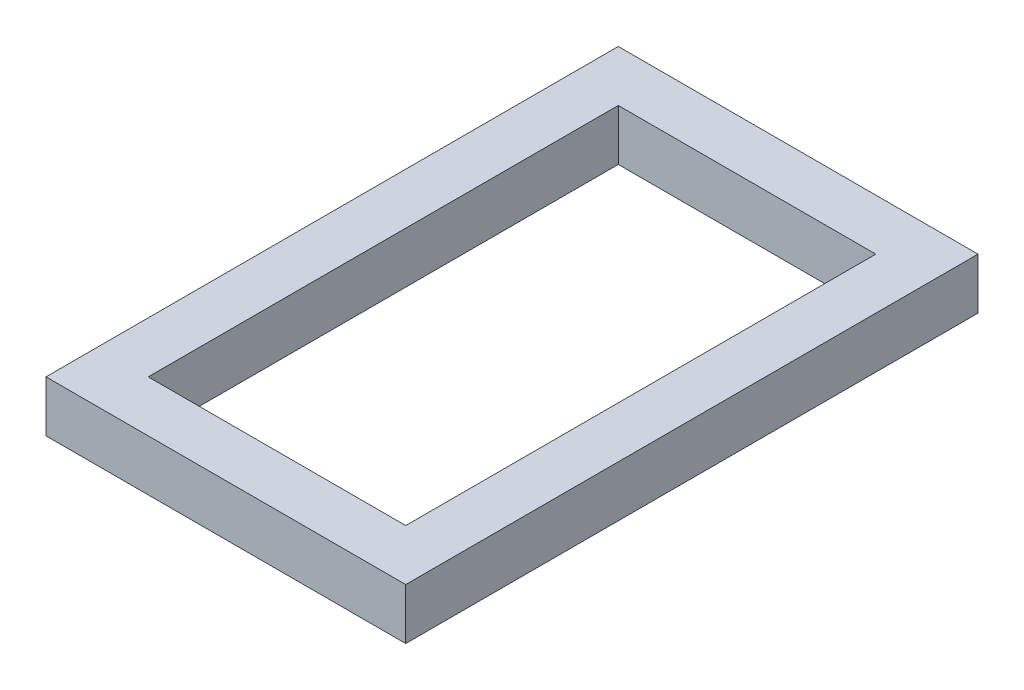
ISO-10303-21;
HEADER;
FILE_DESCRIPTION(('STEP AP214'),'2;1');
FILE_NAME('part.step','',(''),(''),'','','');
FILE_SCHEMA(('AUTOMOTIVE_DESIGN { 1 0 10303 214 1 1 1 1 }'));
ENDSEC;
DATA;
#1=APPLICATION_CONTEXT('core data for automotive mechanical design processes');
#2=APPLICATION_PROTOCOL_DEFINITION('international standard','automotive_design',2000,#1);
#3=PRODUCT_CONTEXT('',#1,'mechanical');
#4=PRODUCT('Part','Part','',(#3));
#5=PRODUCT_RELATED_PRODUCT_CATEGORY('part','',(#4));
#6=PRODUCT_DEFINITION_FORMATION('','',#4);
#7=PRODUCT_DEFINITION_CONTEXT('part definition',#1,'design');
#8=PRODUCT_DEFINITION('design','',#6,#7);
#9=PRODUCT_DEFINITION_SHAPE('','',#8);
#10=(LENGTH_UNIT() NAMED_UNIT(*) SI_UNIT(.MILLI.,.METRE.));
#11=(NAMED_UNIT(*) PLANE_ANGLE_UNIT() SI_UNIT($,.RADIAN.));
#12=(NAMED_UNIT(*) SI_UNIT($,.STERADIAN.) SOLID_ANGLE_UNIT());
#13=UNCERTAINTY_MEASURE_WITH_UNIT(LENGTH_MEASURE(1.E-05),#10,'distance_accuracy_value','');
#14=(GEOMETRIC_REPRESENTATION_CONTEXT(3) GLOBAL_UNCERTAINTY_ASSIGNED_CONTEXT((#13)) GLOBAL_UNIT_ASSIGNED_CONTEXT((#10,
#11,#12)) REPRESENTATION_CONTEXT('',''));
#15=CARTESIAN_POINT('',(0.,0.,0.));
#16=DIRECTION('',(0.,0.,1.));
#17=DIRECTION('',(1.,0.,0.));
#18=AXIS2_PLACEMENT_3D('',#15,#16,#17);
#19=CARTESIAN_POINT('',(0.,2.5,0.));
#20=DIRECTION('',(0.,-1.,0.));
#21=DIRECTION('',(0.,0.,-1.));
#22=AXIS2_PLACEMENT_3D('',#19,#20,#21);
#23=PLANE('',#22);
#24=DIRECTION('',(0.,0.,1.));
#25=VECTOR('',#24,1.);
#26=CARTESIAN_POINT('',(-8.8,2.5,14.));
#27=LINE('',#26,#25);
#28=CARTESIAN_POINT('',(-8.8,2.5,-14.));
#29=VERTEX_POINT('',#28);
#30=CARTESIAN_POINT('',(-8.8,2.5,14.));
#31=VERTEX_POINT('',#30);
#32=EDGE_CURVE('E153',#29,#31,#27,.T.);
#33=ORIENTED_EDGE('',*,*,#32,.T.);
#34=DIRECTION('',(1.,0.,0.));
#35=VECTOR('',#34,1.);
#36=CARTESIAN_POINT('',(-8.8,2.5,14.));
#37=LINE('',#36,#35);
#38=CARTESIAN_POINT('',(8.8,2.5,14.));
#39=VERTEX_POINT('',#38);
#40=EDGE_CURVE('E157',#31,#39,#37,.T.);
#41=ORIENTED_EDGE('',*,*,#40,.T.);
#42=DIRECTION('',(0.,0.,-1.));
#43=VECTOR('',#42,1.);
#44=CARTESIAN_POINT('',(8.8,2.5,14.));
#45=LINE('',#44,#43);
#46=CARTESIAN_POINT('',(8.8,2.5,-14.));
#47=VERTEX_POINT('',#46);
#48=EDGE_CURVE('E161',#39,#47,#45,.T.);
#49=ORIENTED_EDGE('',*,*,#48,.T.);
#50=DIRECTION('',(-1.,0.,0.));
#51=VECTOR('',#50,1.);
#52=CARTESIAN_POINT('',(-8.8,2.5,-14.));
#53=LINE('',#52,#51);
#54=EDGE_CURVE('E164',#47,#29,#53,.T.);
#55=ORIENTED_EDGE('',*,*,#54,.T.);
#56=EDGE_LOOP('',(#33,#41,#49,#55));
#57=FACE_BOUND('',#56,.T.);
#58=DIRECTION('',(0.,0.,-1.));
#59=VECTOR('',#58,1.);
#60=CARTESIAN_POINT('',(6.3,2.5,11.5));
#61=LINE('',#60,#59);
#62=CARTESIAN_POINT('',(6.3,2.5,11.5));
#63=VERTEX_POINT('',#62);
#64=CARTESIAN_POINT('',(6.3,2.5,-11.5));
#65=VERTEX_POINT('',#64);
#66=EDGE_CURVE('E105',#63,#65,#61,.T.);
#67=ORIENTED_EDGE('',*,*,#66,.F.);
#68=DIRECTION('',(1.,0.,0.));
#69=VECTOR('',#68,1.);
#70=CARTESIAN_POINT('',(-6.3,2.5,11.5));
#71=LINE('',#70,#69);
#72=CARTESIAN_POINT('',(-6.3,2.5,11.5));
#73=VERTEX_POINT('',#72);
#74=EDGE_CURVE('E131',#73,#63,#71,.T.);
#75=ORIENTED_EDGE('',*,*,#74,.F.);
#76=DIRECTION('',(0.,0.,1.));
#77=VECTOR('',#76,1.);
#78=CARTESIAN_POINT('',(-6.3,2.5,11.5));
#79=LINE('',#78,#77);
#80=CARTESIAN_POINT('',(-6.3,2.5,-11.5));
#81=VERTEX_POINT('',#80);
#82=EDGE_CURVE('E127',#81,#73,#79,.T.);
#83=ORIENTED_EDGE('',*,*,#82,.F.);
#84=DIRECTION('',(-1.,0.,0.));
#85=VECTOR('',#84,1.);
#86=CARTESIAN_POINT('',(-6.3,2.5,-11.5));
#87=LINE('',#86,#85);
#88=EDGE_CURVE('E114',#65,#81,#87,.T.);
#89=ORIENTED_EDGE('',*,*,#88,.F.);
#90=EDGE_LOOP('',(#67,#75,#83,#89));
#91=FACE_BOUND('',#90,.T.);
#92=ADVANCED_FACE('F39',(#57,#91),#23,.F.);
#93=CARTESIAN_POINT('',(0.,0.,0.));
#94=DIRECTION('',(0.,-1.,0.));
#95=DIRECTION('',(0.,0.,-1.));
#96=AXIS2_PLACEMENT_3D('',#93,#94,#95);
#97=PLANE('',#96);
#98=DIRECTION('',(0.,0.,1.));
#99=VECTOR('',#98,1.);
#100=CARTESIAN_POINT('',(-8.8,0.,14.));
#101=LINE('',#100,#99);
#102=CARTESIAN_POINT('',(-8.8,0.,-14.));
#103=VERTEX_POINT('',#102);
#104=CARTESIAN_POINT('',(-8.8,0.,14.));
#105=VERTEX_POINT('',#104);
#106=EDGE_CURVE('E123',#103,#105,#101,.T.);
#107=ORIENTED_EDGE('',*,*,#106,.F.);
#108=DIRECTION('',(-1.,0.,0.));
#109=VECTOR('',#108,1.);
#110=CARTESIAN_POINT('',(-8.8,0.,-14.));
#111=LINE('',#110,#109);
#112=CARTESIAN_POINT('',(8.8,0.,-14.));
#113=VERTEX_POINT('',#112);
#114=EDGE_CURVE('E158',#113,#103,#111,.T.);
#115=ORIENTED_EDGE('',*,*,#114,.F.);
#116=DIRECTION('',(0.,0.,-1.));
#117=VECTOR('',#116,1.);
#118=CARTESIAN_POINT('',(8.8,0.,14.));
#119=LINE('',#118,#117);
#120=CARTESIAN_POINT('',(8.8,0.,14.));
#121=VERTEX_POINT('',#120);
#122=EDGE_CURVE('E174',#121,#113,#119,.T.);
#123=ORIENTED_EDGE('',*,*,#122,.F.);
#124=DIRECTION('',(1.,0.,0.));
#125=VECTOR('',#124,1.);
#126=CARTESIAN_POINT('',(-8.8,0.,14.));
#127=LINE('',#126,#125);
#128=EDGE_CURVE('E171',#105,#121,#127,.T.);
#129=ORIENTED_EDGE('',*,*,#128,.F.);
#130=EDGE_LOOP('',(#107,#115,#123,#129));
#131=FACE_BOUND('',#130,.T.);
#132=DIRECTION('',(1.,0.,0.));
#133=VECTOR('',#132,1.);
#134=CARTESIAN_POINT('',(-6.3,0.,11.5));
#135=LINE('',#134,#133);
#136=CARTESIAN_POINT('',(-6.3,0.,11.5));
#137=VERTEX_POINT('',#136);
#138=CARTESIAN_POINT('',(6.3,0.,11.5));
#139=VERTEX_POINT('',#138);
#140=EDGE_CURVE('E115',#137,#139,#135,.T.);
#141=ORIENTED_EDGE('',*,*,#140,.T.);
#142=DIRECTION('',(0.,0.,-1.));
#143=VECTOR('',#142,1.);
#144=CARTESIAN_POINT('',(6.3,0.,11.5));
#145=LINE('',#144,#143);
#146=CARTESIAN_POINT('',(6.3,0.,-11.5));
#147=VERTEX_POINT('',#146);
#148=EDGE_CURVE('E63',#139,#147,#145,.T.);
#149=ORIENTED_EDGE('',*,*,#148,.T.);
#150=DIRECTION('',(-1.,0.,0.));
#151=VECTOR('',#150,1.);
#152=CARTESIAN_POINT('',(-6.3,0.,-11.5));
#153=LINE('',#152,#151);
#154=CARTESIAN_POINT('',(-6.3,0.,-11.5));
#155=VERTEX_POINT('',#154);
#156=EDGE_CURVE('E121',#147,#155,#153,.T.);
#157=ORIENTED_EDGE('',*,*,#156,.T.);
#158=DIRECTION('',(0.,0.,1.));
#159=VECTOR('',#158,1.);
#160=CARTESIAN_POINT('',(-6.3,0.,11.5));
#161=LINE('',#160,#159);
#162=EDGE_CURVE('E140',#155,#137,#161,.T.);
#163=ORIENTED_EDGE('',*,*,#162,.T.);
#164=EDGE_LOOP('',(#141,#149,#157,#163));
#165=FACE_BOUND('',#164,.T.);
#166=ADVANCED_FACE('F197',(#131,#165),#97,.T.);
#167=CARTESIAN_POINT('',(-8.8,2.5,14.));
#168=DIRECTION('',(1.,0.,0.));
#169=DIRECTION('',(0.,0.,-1.));
#170=AXIS2_PLACEMENT_3D('',#167,#168,#169);
#171=PLANE('',#170);
#172=ORIENTED_EDGE('',*,*,#106,.T.);
#173=DIRECTION('',(0.,-1.,0.));
#174=VECTOR('',#173,1.);
#175=CARTESIAN_POINT('',(-8.8,2.5,14.));
#176=LINE('',#175,#174);
#177=EDGE_CURVE('E11',#31,#105,#176,.T.);
#178=ORIENTED_EDGE('',*,*,#177,.F.);
#179=ORIENTED_EDGE('',*,*,#32,.F.);
#180=DIRECTION('',(0.,-1.,0.));
#181=VECTOR('',#180,1.);
#182=CARTESIAN_POINT('',(-8.8,2.5,-14.));
#183=LINE('',#182,#181);
#184=EDGE_CURVE('E167',#29,#103,#183,.T.);
#185=ORIENTED_EDGE('',*,*,#184,.T.);
#186=EDGE_LOOP('',(#172,#178,#179,#185));
#187=FACE_BOUND('',#186,.T.);
#188=ADVANCED_FACE('F41',(#187),#171,.F.);
#189=CARTESIAN_POINT('',(-8.8,2.5,14.));
#190=DIRECTION('',(0.,0.,-1.));
#191=DIRECTION('',(-1.,0.,0.));
#192=AXIS2_PLACEMENT_3D('',#189,#190,#191);
#193=PLANE('',#192);
#194=ORIENTED_EDGE('',*,*,#128,.T.);
#195=DIRECTION('',(0.,-1.,0.));
#196=VECTOR('',#195,1.);
#197=CARTESIAN_POINT('',(8.8,2.5,14.));
#198=LINE('',#197,#196);
#199=EDGE_CURVE('E48',#39,#121,#198,.T.);
#200=ORIENTED_EDGE('',*,*,#199,.F.);
#201=ORIENTED_EDGE('',*,*,#40,.F.);
#202=ORIENTED_EDGE('',*,*,#177,.T.);
#203=EDGE_LOOP('',(#194,#200,#201,#202));
#204=FACE_BOUND('',#203,.T.);
#205=ADVANCED_FACE('F207',(#204),#193,.F.);
#206=CARTESIAN_POINT('',(8.8,2.5,14.));
#207=DIRECTION('',(-1.,0.,0.));
#208=DIRECTION('',(0.,0.,1.));
#209=AXIS2_PLACEMENT_3D('',#206,#207,#208);
#210=PLANE('',#209);
#211=ORIENTED_EDGE('',*,*,#122,.T.);
#212=DIRECTION('',(0.,-1.,0.));
#213=VECTOR('',#212,1.);
#214=CARTESIAN_POINT('',(8.8,2.5,-14.));
#215=LINE('',#214,#213);
#216=EDGE_CURVE('E182',#47,#113,#215,.T.);
#217=ORIENTED_EDGE('',*,*,#216,.F.);
#218=ORIENTED_EDGE('',*,*,#48,.F.);
#219=ORIENTED_EDGE('',*,*,#199,.T.);
#220=EDGE_LOOP('',(#211,#217,#218,#219));
#221=FACE_BOUND('',#220,.T.);
#222=ADVANCED_FACE('F191',(#221),#210,.F.);
#223=CARTESIAN_POINT('',(-8.8,2.5,-14.));
#224=DIRECTION('',(0.,0.,1.));
#225=DIRECTION('',(1.,0.,0.));
#226=AXIS2_PLACEMENT_3D('',#223,#224,#225);
#227=PLANE('',#226);
#228=ORIENTED_EDGE('',*,*,#114,.T.);
#229=ORIENTED_EDGE('',*,*,#184,.F.);
#230=ORIENTED_EDGE('',*,*,#54,.F.);
#231=ORIENTED_EDGE('',*,*,#216,.T.);
#232=EDGE_LOOP('',(#228,#229,#230,#231));
#233=FACE_BOUND('',#232,.T.);
#234=ADVANCED_FACE('F201',(#233),#227,.F.);
#235=CARTESIAN_POINT('',(6.3,2.5,11.5));
#236=DIRECTION('',(-1.,0.,0.));
#237=DIRECTION('',(0.,0.,1.));
#238=AXIS2_PLACEMENT_3D('',#235,#236,#237);
#239=PLANE('',#238);
#240=ORIENTED_EDGE('',*,*,#148,.F.);
#241=DIRECTION('',(0.,-1.,0.));
#242=VECTOR('',#241,1.);
#243=CARTESIAN_POINT('',(6.3,2.5,11.5));
#244=LINE('',#243,#242);
#245=EDGE_CURVE('E109',#63,#139,#244,.T.);
#246=ORIENTED_EDGE('',*,*,#245,.F.);
#247=ORIENTED_EDGE('',*,*,#66,.T.);
#248=DIRECTION('',(0.,-1.,0.));
#249=VECTOR('',#248,1.);
#250=CARTESIAN_POINT('',(6.3,2.5,-11.5));
#251=LINE('',#250,#249);
#252=EDGE_CURVE('E108',#65,#147,#251,.T.);
#253=ORIENTED_EDGE('',*,*,#252,.T.);
#254=EDGE_LOOP('',(#240,#246,#247,#253));
#255=FACE_BOUND('',#254,.T.);
#256=ADVANCED_FACE('F107',(#255),#239,.T.);
#257=CARTESIAN_POINT('',(-6.3,2.5,-11.5));
#258=DIRECTION('',(0.,0.,1.));
#259=DIRECTION('',(1.,0.,0.));
#260=AXIS2_PLACEMENT_3D('',#257,#258,#259);
#261=PLANE('',#260);
#262=ORIENTED_EDGE('',*,*,#156,.F.);
#263=ORIENTED_EDGE('',*,*,#252,.F.);
#264=ORIENTED_EDGE('',*,*,#88,.T.);
#265=DIRECTION('',(0.,-1.,0.));
#266=VECTOR('',#265,1.);
#267=CARTESIAN_POINT('',(-6.3,2.5,-11.5));
#268=LINE('',#267,#266);
#269=EDGE_CURVE('E124',#81,#155,#268,.T.);
#270=ORIENTED_EDGE('',*,*,#269,.T.);
#271=EDGE_LOOP('',(#262,#263,#264,#270));
#272=FACE_BOUND('',#271,.T.);
#273=ADVANCED_FACE('F118',(#272),#261,.T.);
#274=CARTESIAN_POINT('',(-6.3,2.5,11.5));
#275=DIRECTION('',(1.,0.,0.));
#276=DIRECTION('',(0.,0.,-1.));
#277=AXIS2_PLACEMENT_3D('',#274,#275,#276);
#278=PLANE('',#277);
#279=ORIENTED_EDGE('',*,*,#162,.F.);
#280=ORIENTED_EDGE('',*,*,#269,.F.);
#281=ORIENTED_EDGE('',*,*,#82,.T.);
#282=DIRECTION('',(0.,-1.,0.));
#283=VECTOR('',#282,1.);
#284=CARTESIAN_POINT('',(-6.3,2.5,11.5));
#285=LINE('',#284,#283);
#286=EDGE_CURVE('E55',#73,#137,#285,.T.);
#287=ORIENTED_EDGE('',*,*,#286,.T.);
#288=EDGE_LOOP('',(#279,#280,#281,#287));
#289=FACE_BOUND('',#288,.T.);
#290=ADVANCED_FACE('F230',(#289),#278,.T.);
#291=CARTESIAN_POINT('',(-6.3,2.5,11.5));
#292=DIRECTION('',(0.,0.,-1.));
#293=DIRECTION('',(-1.,0.,0.));
#294=AXIS2_PLACEMENT_3D('',#291,#292,#293);
#295=PLANE('',#294);
#296=ORIENTED_EDGE('',*,*,#140,.F.);
#297=ORIENTED_EDGE('',*,*,#286,.F.);
#298=ORIENTED_EDGE('',*,*,#74,.T.);
#299=ORIENTED_EDGE('',*,*,#245,.T.);
#300=EDGE_LOOP('',(#296,#297,#298,#299));
#301=FACE_BOUND('',#300,.T.);
#302=ADVANCED_FACE('F234',(#301),#295,.T.);
#303=CLOSED_SHELL('',(#92,#166,#188,#205,#222,#234,#256,#273,#290,#302));
#304=MANIFOLD_SOLID_BREP('B2',#303);
#305=ADVANCED_BREP_SHAPE_REPRESENTATION('',(#18,#304),#14);
#306=SHAPE_DEFINITION_REPRESENTATION(#9,#305);
ENDSEC;
END-ISO-10303-21;
